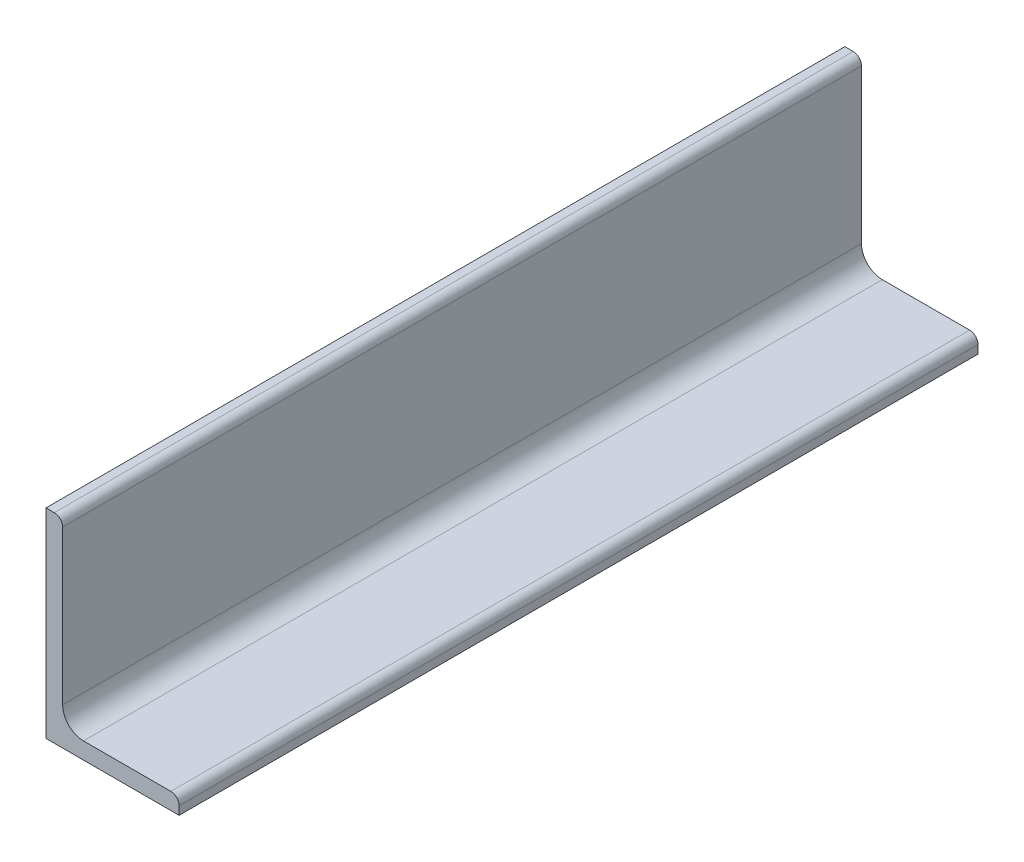
ISO-10303-21;
HEADER;
FILE_DESCRIPTION(('STEP AP214'),'2;1');
FILE_NAME('part.step','',(''),(''),'','','');
FILE_SCHEMA(('AUTOMOTIVE_DESIGN { 1 0 10303 214 1 1 1 1 }'));
ENDSEC;
DATA;
#1=APPLICATION_CONTEXT('core data for automotive mechanical design processes');
#2=APPLICATION_PROTOCOL_DEFINITION('international standard','automotive_design',2000,#1);
#3=PRODUCT_CONTEXT('',#1,'mechanical');
#4=PRODUCT('Part','Part','',(#3));
#5=PRODUCT_RELATED_PRODUCT_CATEGORY('part','',(#4));
#6=PRODUCT_DEFINITION_FORMATION('','',#4);
#7=PRODUCT_DEFINITION_CONTEXT('part definition',#1,'design');
#8=PRODUCT_DEFINITION('design','',#6,#7);
#9=PRODUCT_DEFINITION_SHAPE('','',#8);
#10=(LENGTH_UNIT() NAMED_UNIT(*) SI_UNIT(.MILLI.,.METRE.));
#11=(NAMED_UNIT(*) PLANE_ANGLE_UNIT() SI_UNIT($,.RADIAN.));
#12=(NAMED_UNIT(*) SI_UNIT($,.STERADIAN.) SOLID_ANGLE_UNIT());
#13=UNCERTAINTY_MEASURE_WITH_UNIT(LENGTH_MEASURE(1.E-05),#10,'distance_accuracy_value','');
#14=(GEOMETRIC_REPRESENTATION_CONTEXT(3) GLOBAL_UNCERTAINTY_ASSIGNED_CONTEXT((#13)) GLOBAL_UNIT_ASSIGNED_CONTEXT((#10,
#11,#12)) REPRESENTATION_CONTEXT('',''));
#15=CARTESIAN_POINT('',(0.,0.,0.));
#16=DIRECTION('',(0.,0.,1.));
#17=DIRECTION('',(1.,0.,0.));
#18=AXIS2_PLACEMENT_3D('',#15,#16,#17);
#19=CARTESIAN_POINT('',(0.116507760447575,76.2882459217981,304.8));
#20=DIRECTION('',(1.,0.,0.));
#21=DIRECTION('',(0.,0.,-1.));
#22=AXIS2_PLACEMENT_3D('',#19,#20,#21);
#23=PLANE('',#22);
#24=DIRECTION('',(0.,-1.,0.));
#25=VECTOR('',#24,1.);
#26=CARTESIAN_POINT('',(0.116507760447575,76.2882459217981,0.));
#27=LINE('',#26,#25);
#28=CARTESIAN_POINT('',(0.116507760447575,76.2882459217981,0.));
#29=VERTEX_POINT('',#28);
#30=CARTESIAN_POINT('',(0.116507760447575,0.0882459217980795,0.));
#31=VERTEX_POINT('',#30);
#32=EDGE_CURVE('E135',#29,#31,#27,.T.);
#33=ORIENTED_EDGE('',*,*,#32,.T.);
#34=DIRECTION('',(0.,0.,-1.));
#35=VECTOR('',#34,1.);
#36=CARTESIAN_POINT('',(0.116507760447575,0.0882459217980795,304.8));
#37=LINE('',#36,#35);
#38=CARTESIAN_POINT('',(0.116507760447575,0.0882459217980795,304.8));
#39=VERTEX_POINT('',#38);
#40=EDGE_CURVE('E11',#39,#31,#37,.T.);
#41=ORIENTED_EDGE('',*,*,#40,.F.);
#42=DIRECTION('',(0.,-1.,0.));
#43=VECTOR('',#42,1.);
#44=CARTESIAN_POINT('',(0.116507760447575,76.2882459217981,304.8));
#45=LINE('',#44,#43);
#46=CARTESIAN_POINT('',(0.116507760447575,76.2882459217981,304.8));
#47=VERTEX_POINT('',#46);
#48=EDGE_CURVE('E151',#47,#39,#45,.T.);
#49=ORIENTED_EDGE('',*,*,#48,.F.);
#50=DIRECTION('',(0.,0.,-1.));
#51=VECTOR('',#50,1.);
#52=CARTESIAN_POINT('',(0.116507760447575,76.2882459217981,304.8));
#53=LINE('',#52,#51);
#54=EDGE_CURVE('E131',#47,#29,#53,.T.);
#55=ORIENTED_EDGE('',*,*,#54,.T.);
#56=EDGE_LOOP('',(#33,#41,#49,#55));
#57=FACE_BOUND('',#56,.T.);
#58=ADVANCED_FACE('F33',(#57),#23,.F.);
#59=CARTESIAN_POINT('',(0.116507760447575,0.0882459217980795,304.8));
#60=DIRECTION('',(0.,1.,0.));
#61=DIRECTION('',(0.,0.,1.));
#62=AXIS2_PLACEMENT_3D('',#59,#60,#61);
#63=PLANE('',#62);
#64=DIRECTION('',(1.,0.,0.));
#65=VECTOR('',#64,1.);
#66=CARTESIAN_POINT('',(0.116507760447575,0.0882459217980795,0.));
#67=LINE('',#66,#65);
#68=CARTESIAN_POINT('',(50.9165077604476,0.0882459217980795,0.));
#69=VERTEX_POINT('',#68);
#70=EDGE_CURVE('E138',#31,#69,#67,.T.);
#71=ORIENTED_EDGE('',*,*,#70,.T.);
#72=DIRECTION('',(0.,0.,-1.));
#73=VECTOR('',#72,1.);
#74=CARTESIAN_POINT('',(50.9165077604476,0.0882459217980795,304.8));
#75=LINE('',#74,#73);
#76=CARTESIAN_POINT('',(50.9165077604476,0.0882459217980795,304.8));
#77=VERTEX_POINT('',#76);
#78=EDGE_CURVE('E41',#77,#69,#75,.T.);
#79=ORIENTED_EDGE('',*,*,#78,.F.);
#80=DIRECTION('',(1.,0.,0.));
#81=VECTOR('',#80,1.);
#82=CARTESIAN_POINT('',(0.116507760447575,0.0882459217980795,304.8));
#83=LINE('',#82,#81);
#84=EDGE_CURVE('E95',#39,#77,#83,.T.);
#85=ORIENTED_EDGE('',*,*,#84,.F.);
#86=ORIENTED_EDGE('',*,*,#40,.T.);
#87=EDGE_LOOP('',(#71,#79,#85,#86));
#88=FACE_BOUND('',#87,.T.);
#89=ADVANCED_FACE('F194',(#88),#63,.F.);
#90=CARTESIAN_POINT('',(50.9165077604476,0.0882459217980795,304.8));
#91=DIRECTION('',(-1.,0.,0.));
#92=DIRECTION('',(0.,0.,1.));
#93=AXIS2_PLACEMENT_3D('',#90,#91,#92);
#94=PLANE('',#93);
#95=DIRECTION('',(0.,1.,0.));
#96=VECTOR('',#95,1.);
#97=CARTESIAN_POINT('',(50.9165077604476,0.0882459217980795,0.));
#98=LINE('',#97,#96);
#99=CARTESIAN_POINT('',(50.9165077604476,3.26324592179808,0.));
#100=VERTEX_POINT('',#99);
#101=EDGE_CURVE('E140',#69,#100,#98,.T.);
#102=ORIENTED_EDGE('',*,*,#101,.T.);
#103=DIRECTION('',(0.,0.,-1.));
#104=VECTOR('',#103,1.);
#105=CARTESIAN_POINT('',(50.9165077604476,3.26324592179808,304.8));
#106=LINE('',#105,#104);
#107=CARTESIAN_POINT('',(50.9165077604476,3.26324592179808,304.8));
#108=VERTEX_POINT('',#107);
#109=EDGE_CURVE('E161',#108,#100,#106,.T.);
#110=ORIENTED_EDGE('',*,*,#109,.F.);
#111=DIRECTION('',(0.,1.,0.));
#112=VECTOR('',#111,1.);
#113=CARTESIAN_POINT('',(50.9165077604476,0.0882459217980795,304.8));
#114=LINE('',#113,#112);
#115=EDGE_CURVE('E169',#77,#108,#114,.T.);
#116=ORIENTED_EDGE('',*,*,#115,.F.);
#117=ORIENTED_EDGE('',*,*,#78,.T.);
#118=EDGE_LOOP('',(#102,#110,#116,#117));
#119=FACE_BOUND('',#118,.T.);
#120=ADVANCED_FACE('F167',(#119),#94,.F.);
#121=CARTESIAN_POINT('',(47.7415077604476,3.26324592179808,304.8));
#122=DIRECTION('',(0.,0.,-1.));
#123=DIRECTION('',(-1.,0.,0.));
#124=AXIS2_PLACEMENT_3D('',#121,#122,#123);
#125=CYLINDRICAL_SURFACE('',#124,3.175);
#126=CARTESIAN_POINT('',(47.7415077604476,3.26324592179808,0.));
#127=DIRECTION('',(0.,0.,1.));
#128=DIRECTION('',(1.,0.,0.));
#129=AXIS2_PLACEMENT_3D('',#126,#127,#128);
#130=CIRCLE('',#129,3.175);
#131=CARTESIAN_POINT('',(47.7415077604476,6.43824592179808,0.));
#132=VERTEX_POINT('',#131);
#133=EDGE_CURVE('E142',#100,#132,#130,.T.);
#134=ORIENTED_EDGE('',*,*,#133,.T.);
#135=DIRECTION('',(0.,0.,-1.));
#136=VECTOR('',#135,1.);
#137=CARTESIAN_POINT('',(47.7415077604476,6.43824592179808,304.8));
#138=LINE('',#137,#136);
#139=CARTESIAN_POINT('',(47.7415077604476,6.43824592179808,304.8));
#140=VERTEX_POINT('',#139);
#141=EDGE_CURVE('E158',#140,#132,#138,.T.);
#142=ORIENTED_EDGE('',*,*,#141,.F.);
#143=CARTESIAN_POINT('',(47.7415077604476,3.26324592179808,304.8));
#144=DIRECTION('',(0.,0.,1.));
#145=DIRECTION('',(1.,0.,0.));
#146=AXIS2_PLACEMENT_3D('',#143,#144,#145);
#147=CIRCLE('',#146,3.175);
#148=EDGE_CURVE('E185',#108,#140,#147,.T.);
#149=ORIENTED_EDGE('',*,*,#148,.F.);
#150=ORIENTED_EDGE('',*,*,#109,.T.);
#151=EDGE_LOOP('',(#134,#142,#149,#150));
#152=FACE_BOUND('',#151,.T.);
#153=ADVANCED_FACE('F178',(#152),#125,.T.);
#154=CARTESIAN_POINT('',(47.7415077604476,6.43824592179808,304.8));
#155=DIRECTION('',(0.,-1.,0.));
#156=DIRECTION('',(0.,0.,-1.));
#157=AXIS2_PLACEMENT_3D('',#154,#155,#156);
#158=PLANE('',#157);
#159=DIRECTION('',(-1.,0.,0.));
#160=VECTOR('',#159,1.);
#161=CARTESIAN_POINT('',(47.7415077604476,6.43824592179808,0.));
#162=LINE('',#161,#160);
#163=CARTESIAN_POINT('',(14.4040077604476,6.43824592179808,0.));
#164=VERTEX_POINT('',#163);
#165=EDGE_CURVE('E144',#132,#164,#162,.T.);
#166=ORIENTED_EDGE('',*,*,#165,.T.);
#167=DIRECTION('',(0.,0.,-1.));
#168=VECTOR('',#167,1.);
#169=CARTESIAN_POINT('',(14.4040077604476,6.43824592179808,304.8));
#170=LINE('',#169,#168);
#171=CARTESIAN_POINT('',(14.4040077604476,6.43824592179808,304.8));
#172=VERTEX_POINT('',#171);
#173=EDGE_CURVE('E155',#172,#164,#170,.T.);
#174=ORIENTED_EDGE('',*,*,#173,.F.);
#175=DIRECTION('',(-1.,0.,0.));
#176=VECTOR('',#175,1.);
#177=CARTESIAN_POINT('',(47.7415077604476,6.43824592179808,304.8));
#178=LINE('',#177,#176);
#179=EDGE_CURVE('E184',#140,#172,#178,.T.);
#180=ORIENTED_EDGE('',*,*,#179,.F.);
#181=ORIENTED_EDGE('',*,*,#141,.T.);
#182=EDGE_LOOP('',(#166,#174,#180,#181));
#183=FACE_BOUND('',#182,.T.);
#184=ADVANCED_FACE('F182',(#183),#158,.F.);
#185=CARTESIAN_POINT('',(14.4040077604476,14.3757459217981,304.8));
#186=DIRECTION('',(0.,0.,-1.));
#187=DIRECTION('',(-1.,0.,0.));
#188=AXIS2_PLACEMENT_3D('',#185,#186,#187);
#189=CYLINDRICAL_SURFACE('',#188,7.93749999999999);
#190=CARTESIAN_POINT('',(14.4040077604476,14.3757459217981,0.));
#191=DIRECTION('',(0.,0.,-1.));
#192=DIRECTION('',(1.,0.,0.));
#193=AXIS2_PLACEMENT_3D('',#190,#191,#192);
#194=CIRCLE('',#193,7.93749999999999);
#195=CARTESIAN_POINT('',(6.46650776044757,14.3757459217981,0.));
#196=VERTEX_POINT('',#195);
#197=EDGE_CURVE('E146',#164,#196,#194,.T.);
#198=ORIENTED_EDGE('',*,*,#197,.T.);
#199=DIRECTION('',(0.,0.,-1.));
#200=VECTOR('',#199,1.);
#201=CARTESIAN_POINT('',(6.46650776044757,14.3757459217981,304.8));
#202=LINE('',#201,#200);
#203=CARTESIAN_POINT('',(6.46650776044757,14.3757459217981,304.8));
#204=VERTEX_POINT('',#203);
#205=EDGE_CURVE('E126',#204,#196,#202,.T.);
#206=ORIENTED_EDGE('',*,*,#205,.F.);
#207=CARTESIAN_POINT('',(14.4040077604476,14.3757459217981,304.8));
#208=DIRECTION('',(0.,0.,-1.));
#209=DIRECTION('',(1.,0.,0.));
#210=AXIS2_PLACEMENT_3D('',#207,#208,#209);
#211=CIRCLE('',#210,7.93749999999999);
#212=EDGE_CURVE('E117',#172,#204,#211,.T.);
#213=ORIENTED_EDGE('',*,*,#212,.F.);
#214=ORIENTED_EDGE('',*,*,#173,.T.);
#215=EDGE_LOOP('',(#198,#206,#213,#214));
#216=FACE_BOUND('',#215,.T.);
#217=ADVANCED_FACE('F206',(#216),#189,.F.);
#218=CARTESIAN_POINT('',(6.46650776044757,14.3757459217981,304.8));
#219=DIRECTION('',(-1.,0.,0.));
#220=DIRECTION('',(0.,0.,1.));
#221=AXIS2_PLACEMENT_3D('',#218,#219,#220);
#222=PLANE('',#221);
#223=DIRECTION('',(0.,1.,0.));
#224=VECTOR('',#223,1.);
#225=CARTESIAN_POINT('',(6.46650776044757,14.3757459217981,0.));
#226=LINE('',#225,#224);
#227=CARTESIAN_POINT('',(6.46650776044757,73.1132459217981,0.));
#228=VERTEX_POINT('',#227);
#229=EDGE_CURVE('E125',#196,#228,#226,.T.);
#230=ORIENTED_EDGE('',*,*,#229,.T.);
#231=DIRECTION('',(0.,0.,-1.));
#232=VECTOR('',#231,1.);
#233=CARTESIAN_POINT('',(6.46650776044757,73.1132459217981,304.8));
#234=LINE('',#233,#232);
#235=CARTESIAN_POINT('',(6.46650776044757,73.1132459217981,304.8));
#236=VERTEX_POINT('',#235);
#237=EDGE_CURVE('E122',#236,#228,#234,.T.);
#238=ORIENTED_EDGE('',*,*,#237,.F.);
#239=DIRECTION('',(0.,1.,0.));
#240=VECTOR('',#239,1.);
#241=CARTESIAN_POINT('',(6.46650776044757,14.3757459217981,304.8));
#242=LINE('',#241,#240);
#243=EDGE_CURVE('E111',#204,#236,#242,.T.);
#244=ORIENTED_EDGE('',*,*,#243,.F.);
#245=ORIENTED_EDGE('',*,*,#205,.T.);
#246=EDGE_LOOP('',(#230,#238,#244,#245));
#247=FACE_BOUND('',#246,.T.);
#248=ADVANCED_FACE('F123',(#247),#222,.F.);
#249=CARTESIAN_POINT('',(3.29150776044757,73.1132459217981,304.8));
#250=DIRECTION('',(0.,0.,-1.));
#251=DIRECTION('',(-1.,0.,0.));
#252=AXIS2_PLACEMENT_3D('',#249,#250,#251);
#253=CYLINDRICAL_SURFACE('',#252,3.175);
#254=CARTESIAN_POINT('',(3.29150776044757,73.1132459217981,0.));
#255=DIRECTION('',(0.,0.,1.));
#256=DIRECTION('',(1.,0.,0.));
#257=AXIS2_PLACEMENT_3D('',#254,#255,#256);
#258=CIRCLE('',#257,3.175);
#259=CARTESIAN_POINT('',(3.29150776044758,76.2882459217981,0.));
#260=VERTEX_POINT('',#259);
#261=EDGE_CURVE('E81',#228,#260,#258,.T.);
#262=ORIENTED_EDGE('',*,*,#261,.T.);
#263=DIRECTION('',(0.,0.,-1.));
#264=VECTOR('',#263,1.);
#265=CARTESIAN_POINT('',(3.29150776044758,76.2882459217981,304.8));
#266=LINE('',#265,#264);
#267=CARTESIAN_POINT('',(3.29150776044758,76.2882459217981,304.8));
#268=VERTEX_POINT('',#267);
#269=EDGE_CURVE('E127',#268,#260,#266,.T.);
#270=ORIENTED_EDGE('',*,*,#269,.F.);
#271=CARTESIAN_POINT('',(3.29150776044757,73.1132459217981,304.8));
#272=DIRECTION('',(0.,0.,1.));
#273=DIRECTION('',(1.,0.,0.));
#274=AXIS2_PLACEMENT_3D('',#271,#272,#273);
#275=CIRCLE('',#274,3.175);
#276=EDGE_CURVE('E115',#236,#268,#275,.T.);
#277=ORIENTED_EDGE('',*,*,#276,.F.);
#278=ORIENTED_EDGE('',*,*,#237,.T.);
#279=EDGE_LOOP('',(#262,#270,#277,#278));
#280=FACE_BOUND('',#279,.T.);
#281=ADVANCED_FACE('F129',(#280),#253,.T.);
#282=CARTESIAN_POINT('',(3.29150776044758,76.2882459217981,304.8));
#283=DIRECTION('',(0.,-1.,0.));
#284=DIRECTION('',(0.,0.,-1.));
#285=AXIS2_PLACEMENT_3D('',#282,#283,#284);
#286=PLANE('',#285);
#287=DIRECTION('',(-1.,0.,0.));
#288=VECTOR('',#287,1.);
#289=CARTESIAN_POINT('',(3.29150776044758,76.2882459217981,0.));
#290=LINE('',#289,#288);
#291=EDGE_CURVE('E87',#260,#29,#290,.T.);
#292=ORIENTED_EDGE('',*,*,#291,.T.);
#293=ORIENTED_EDGE('',*,*,#54,.F.);
#294=DIRECTION('',(-1.,0.,0.));
#295=VECTOR('',#294,1.);
#296=CARTESIAN_POINT('',(3.29150776044758,76.2882459217981,304.8));
#297=LINE('',#296,#295);
#298=EDGE_CURVE('E49',#268,#47,#297,.T.);
#299=ORIENTED_EDGE('',*,*,#298,.F.);
#300=ORIENTED_EDGE('',*,*,#269,.T.);
#301=EDGE_LOOP('',(#292,#293,#299,#300));
#302=FACE_BOUND('',#301,.T.);
#303=ADVANCED_FACE('F214',(#302),#286,.F.);
#304=CARTESIAN_POINT('',(47.7415077604476,3.26324592179808,304.8));
#305=DIRECTION('',(0.,0.,1.));
#306=DIRECTION('',(1.,0.,0.));
#307=AXIS2_PLACEMENT_3D('',#304,#305,#306);
#308=PLANE('',#307);
#309=ORIENTED_EDGE('',*,*,#48,.T.);
#310=ORIENTED_EDGE('',*,*,#84,.T.);
#311=ORIENTED_EDGE('',*,*,#115,.T.);
#312=ORIENTED_EDGE('',*,*,#148,.T.);
#313=ORIENTED_EDGE('',*,*,#179,.T.);
#314=ORIENTED_EDGE('',*,*,#212,.T.);
#315=ORIENTED_EDGE('',*,*,#243,.T.);
#316=ORIENTED_EDGE('',*,*,#276,.T.);
#317=ORIENTED_EDGE('',*,*,#298,.T.);
#318=EDGE_LOOP('',(#309,#310,#311,#312,#313,#314,#315,#316,#317));
#319=FACE_BOUND('',#318,.T.);
#320=ADVANCED_FACE('F113',(#319),#308,.T.);
#321=CARTESIAN_POINT('',(47.7415077604476,3.26324592179808,0.));
#322=DIRECTION('',(0.,0.,1.));
#323=DIRECTION('',(1.,0.,0.));
#324=AXIS2_PLACEMENT_3D('',#321,#322,#323);
#325=PLANE('',#324);
#326=ORIENTED_EDGE('',*,*,#32,.F.);
#327=ORIENTED_EDGE('',*,*,#291,.F.);
#328=ORIENTED_EDGE('',*,*,#261,.F.);
#329=ORIENTED_EDGE('',*,*,#229,.F.);
#330=ORIENTED_EDGE('',*,*,#197,.F.);
#331=ORIENTED_EDGE('',*,*,#165,.F.);
#332=ORIENTED_EDGE('',*,*,#133,.F.);
#333=ORIENTED_EDGE('',*,*,#101,.F.);
#334=ORIENTED_EDGE('',*,*,#70,.F.);
#335=EDGE_LOOP('',(#326,#327,#328,#329,#330,#331,#332,#333,#334));
#336=FACE_BOUND('',#335,.T.);
#337=ADVANCED_FACE('F173',(#336),#325,.F.);
#338=CLOSED_SHELL('',(#58,#89,#120,#153,#184,#217,#248,#281,#303,#320,#337));
#339=MANIFOLD_SOLID_BREP('B2',#338);
#340=ADVANCED_BREP_SHAPE_REPRESENTATION('',(#18,#339),#14);
#341=SHAPE_DEFINITION_REPRESENTATION(#9,#340);
ENDSEC;
END-ISO-10303-21;
